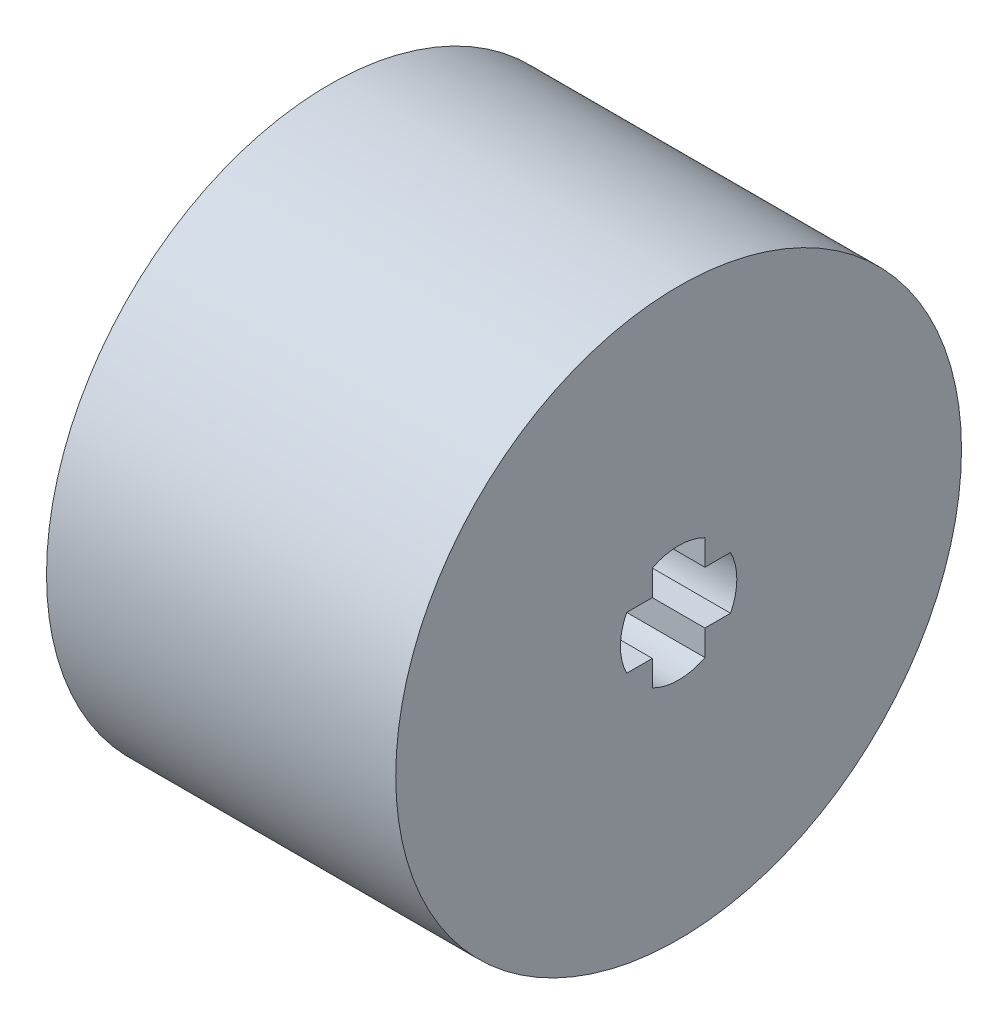
ISO-10303-21;
HEADER;
FILE_DESCRIPTION(('STEP AP214'),'2;1');
FILE_NAME('part.step','',(''),(''),'','','');
FILE_SCHEMA(('AUTOMOTIVE_DESIGN { 1 0 10303 214 1 1 1 1 }'));
ENDSEC;
DATA;
#1=APPLICATION_CONTEXT('core data for automotive mechanical design processes');
#2=APPLICATION_PROTOCOL_DEFINITION('international standard','automotive_design',2000,#1);
#3=PRODUCT_CONTEXT('',#1,'mechanical');
#4=PRODUCT('Part','Part','',(#3));
#5=PRODUCT_RELATED_PRODUCT_CATEGORY('part','',(#4));
#6=PRODUCT_DEFINITION_FORMATION('','',#4);
#7=PRODUCT_DEFINITION_CONTEXT('part definition',#1,'design');
#8=PRODUCT_DEFINITION('design','',#6,#7);
#9=PRODUCT_DEFINITION_SHAPE('','',#8);
#10=(LENGTH_UNIT() NAMED_UNIT(*) SI_UNIT(.MILLI.,.METRE.));
#11=(NAMED_UNIT(*) PLANE_ANGLE_UNIT() SI_UNIT($,.RADIAN.));
#12=(NAMED_UNIT(*) SI_UNIT($,.STERADIAN.) SOLID_ANGLE_UNIT());
#13=UNCERTAINTY_MEASURE_WITH_UNIT(LENGTH_MEASURE(1.E-05),#10,'distance_accuracy_value','');
#14=(GEOMETRIC_REPRESENTATION_CONTEXT(3) GLOBAL_UNCERTAINTY_ASSIGNED_CONTEXT((#13)) GLOBAL_UNIT_ASSIGNED_CONTEXT((#10,
#11,#12)) REPRESENTATION_CONTEXT('',''));
#15=CARTESIAN_POINT('',(0.,0.,0.));
#16=DIRECTION('',(0.,0.,1.));
#17=DIRECTION('',(1.,0.,0.));
#18=AXIS2_PLACEMENT_3D('',#15,#16,#17);
#19=CARTESIAN_POINT('',(0.,0.,1.13002976164114));
#20=DIRECTION('',(0.,0.,-1.));
#21=DIRECTION('',(-1.,0.,0.));
#22=AXIS2_PLACEMENT_3D('',#19,#20,#21);
#23=PLANE('',#22);
#24=DIRECTION('',(1.,0.,0.));
#25=VECTOR('',#24,1.);
#26=CARTESIAN_POINT('',(0.,1.13002976164115,1.13002976164114));
#27=LINE('',#26,#25);
#28=CARTESIAN_POINT('',(7.,1.13002976164115,1.13002976164114));
#29=VERTEX_POINT('',#28);
#30=CARTESIAN_POINT('',(15.,1.13002976164115,1.13002976164114));
#31=VERTEX_POINT('',#30);
#32=EDGE_CURVE('E59',#29,#31,#27,.T.);
#33=ORIENTED_EDGE('',*,*,#32,.F.);
#34=DIRECTION('',(0.,1.,0.));
#35=VECTOR('',#34,1.);
#36=CARTESIAN_POINT('',(7.,0.,1.13002976164114));
#37=LINE('',#36,#35);
#38=CARTESIAN_POINT('',(7.,2.23002976164114,1.13002976164114));
#39=VERTEX_POINT('',#38);
#40=EDGE_CURVE('E53',#29,#39,#37,.T.);
#41=ORIENTED_EDGE('',*,*,#40,.T.);
#42=DIRECTION('',(1.,0.,0.));
#43=VECTOR('',#42,1.);
#44=CARTESIAN_POINT('',(0.,2.23002976164114,1.13002976164114));
#45=LINE('',#44,#43);
#46=CARTESIAN_POINT('',(15.,2.23002976164114,1.13002976164114));
#47=VERTEX_POINT('',#46);
#48=EDGE_CURVE('E153',#39,#47,#45,.T.);
#49=ORIENTED_EDGE('',*,*,#48,.T.);
#50=DIRECTION('',(0.,1.,0.));
#51=VECTOR('',#50,1.);
#52=CARTESIAN_POINT('',(15.,0.,1.13002976164114));
#53=LINE('',#52,#51);
#54=EDGE_CURVE('E223',#31,#47,#53,.T.);
#55=ORIENTED_EDGE('',*,*,#54,.F.);
#56=EDGE_LOOP('',(#33,#41,#49,#55));
#57=FACE_BOUND('',#56,.T.);
#58=ADVANCED_FACE('F38',(#57),#23,.T.);
#59=CARTESIAN_POINT('',(0.,0.,0.));
#60=DIRECTION('',(1.,0.,0.));
#61=DIRECTION('',(0.,0.,-1.));
#62=AXIS2_PLACEMENT_3D('',#59,#60,#61);
#63=CYLINDRICAL_SURFACE('',#62,2.5);
#64=CARTESIAN_POINT('',(7.,0.,0.));
#65=DIRECTION('',(-1.,0.,0.));
#66=DIRECTION('',(0.,0.,1.));
#67=AXIS2_PLACEMENT_3D('',#64,#65,#66);
#68=CIRCLE('',#67,2.5);
#69=CARTESIAN_POINT('',(7.,2.23002976164114,-1.13002976164114));
#70=VERTEX_POINT('',#69);
#71=EDGE_CURVE('E234',#70,#39,#68,.F.);
#72=ORIENTED_EDGE('',*,*,#71,.F.);
#73=DIRECTION('',(1.,0.,0.));
#74=VECTOR('',#73,1.);
#75=CARTESIAN_POINT('',(0.,2.23002976164114,-1.13002976164114));
#76=LINE('',#75,#74);
#77=CARTESIAN_POINT('',(15.,2.23002976164114,-1.13002976164114));
#78=VERTEX_POINT('',#77);
#79=EDGE_CURVE('E156',#70,#78,#76,.T.);
#80=ORIENTED_EDGE('',*,*,#79,.T.);
#81=CARTESIAN_POINT('',(15.,0.,0.));
#82=DIRECTION('',(1.,0.,0.));
#83=DIRECTION('',(0.,0.,-1.));
#84=AXIS2_PLACEMENT_3D('',#81,#82,#83);
#85=CIRCLE('',#84,2.5);
#86=EDGE_CURVE('E146',#78,#47,#85,.T.);
#87=ORIENTED_EDGE('',*,*,#86,.T.);
#88=ORIENTED_EDGE('',*,*,#48,.F.);
#89=EDGE_LOOP('',(#72,#80,#87,#88));
#90=FACE_BOUND('',#89,.T.);
#91=ADVANCED_FACE('F222',(#90),#63,.F.);
#92=CARTESIAN_POINT('',(0.,0.,-1.13002976164114));
#93=DIRECTION('',(0.,0.,-1.));
#94=DIRECTION('',(-1.,0.,0.));
#95=AXIS2_PLACEMENT_3D('',#92,#93,#94);
#96=PLANE('',#95);
#97=DIRECTION('',(0.,1.,0.));
#98=VECTOR('',#97,1.);
#99=CARTESIAN_POINT('',(7.,0.,-1.13002976164114));
#100=LINE('',#99,#98);
#101=CARTESIAN_POINT('',(7.,1.13002976164115,-1.13002976164114));
#102=VERTEX_POINT('',#101);
#103=EDGE_CURVE('E236',#102,#70,#100,.T.);
#104=ORIENTED_EDGE('',*,*,#103,.F.);
#105=DIRECTION('',(1.,0.,0.));
#106=VECTOR('',#105,1.);
#107=CARTESIAN_POINT('',(0.,1.13002976164115,-1.13002976164114));
#108=LINE('',#107,#106);
#109=CARTESIAN_POINT('',(15.,1.13002976164115,-1.13002976164114));
#110=VERTEX_POINT('',#109);
#111=EDGE_CURVE('E161',#102,#110,#108,.T.);
#112=ORIENTED_EDGE('',*,*,#111,.T.);
#113=DIRECTION('',(0.,1.,0.));
#114=VECTOR('',#113,1.);
#115=CARTESIAN_POINT('',(15.,0.,-1.13002976164114));
#116=LINE('',#115,#114);
#117=EDGE_CURVE('E213',#110,#78,#116,.T.);
#118=ORIENTED_EDGE('',*,*,#117,.T.);
#119=ORIENTED_EDGE('',*,*,#79,.F.);
#120=EDGE_LOOP('',(#104,#112,#118,#119));
#121=FACE_BOUND('',#120,.T.);
#122=ADVANCED_FACE('F290',(#121),#96,.F.);
#123=CARTESIAN_POINT('',(0.,1.13002976164115,0.));
#124=DIRECTION('',(0.,-1.,0.));
#125=DIRECTION('',(0.,0.,-1.));
#126=AXIS2_PLACEMENT_3D('',#123,#124,#125);
#127=PLANE('',#126);
#128=ORIENTED_EDGE('',*,*,#111,.F.);
#129=DIRECTION('',(0.,0.,-1.));
#130=VECTOR('',#129,1.);
#131=CARTESIAN_POINT('',(7.,1.13002976164115,0.));
#132=LINE('',#131,#130);
#133=CARTESIAN_POINT('',(7.,1.13002976164115,-2.23002976164114));
#134=VERTEX_POINT('',#133);
#135=EDGE_CURVE('E238',#102,#134,#132,.T.);
#136=ORIENTED_EDGE('',*,*,#135,.T.);
#137=DIRECTION('',(1.,0.,0.));
#138=VECTOR('',#137,1.);
#139=CARTESIAN_POINT('',(0.,1.13002976164115,-2.23002976164114));
#140=LINE('',#139,#138);
#141=CARTESIAN_POINT('',(15.,1.13002976164115,-2.23002976164114));
#142=VERTEX_POINT('',#141);
#143=EDGE_CURVE('E167',#134,#142,#140,.T.);
#144=ORIENTED_EDGE('',*,*,#143,.T.);
#145=DIRECTION('',(0.,0.,-1.));
#146=VECTOR('',#145,1.);
#147=CARTESIAN_POINT('',(15.,1.13002976164115,0.));
#148=LINE('',#147,#146);
#149=EDGE_CURVE('E211',#110,#142,#148,.T.);
#150=ORIENTED_EDGE('',*,*,#149,.F.);
#151=EDGE_LOOP('',(#128,#136,#144,#150));
#152=FACE_BOUND('',#151,.T.);
#153=ADVANCED_FACE('F316',(#152),#127,.T.);
#154=CARTESIAN_POINT('',(0.,0.,0.));
#155=DIRECTION('',(1.,0.,0.));
#156=DIRECTION('',(0.,0.,-1.));
#157=AXIS2_PLACEMENT_3D('',#154,#155,#156);
#158=CYLINDRICAL_SURFACE('',#157,2.5);
#159=CARTESIAN_POINT('',(7.,0.,0.));
#160=DIRECTION('',(-1.,0.,0.));
#161=DIRECTION('',(0.,0.,1.));
#162=AXIS2_PLACEMENT_3D('',#159,#160,#161);
#163=CIRCLE('',#162,2.5);
#164=CARTESIAN_POINT('',(7.,-1.13002976164115,-2.23002976164114));
#165=VERTEX_POINT('',#164);
#166=EDGE_CURVE('E241',#165,#134,#163,.F.);
#167=ORIENTED_EDGE('',*,*,#166,.F.);
#168=DIRECTION('',(1.,0.,0.));
#169=VECTOR('',#168,1.);
#170=CARTESIAN_POINT('',(0.,-1.13002976164115,-2.23002976164114));
#171=LINE('',#170,#169);
#172=CARTESIAN_POINT('',(15.,-1.13002976164115,-2.23002976164114));
#173=VERTEX_POINT('',#172);
#174=EDGE_CURVE('E169',#165,#173,#171,.T.);
#175=ORIENTED_EDGE('',*,*,#174,.T.);
#176=CARTESIAN_POINT('',(15.,0.,0.));
#177=DIRECTION('',(1.,0.,0.));
#178=DIRECTION('',(0.,0.,-1.));
#179=AXIS2_PLACEMENT_3D('',#176,#177,#178);
#180=CIRCLE('',#179,2.5);
#181=EDGE_CURVE('E208',#173,#142,#180,.T.);
#182=ORIENTED_EDGE('',*,*,#181,.T.);
#183=ORIENTED_EDGE('',*,*,#143,.F.);
#184=EDGE_LOOP('',(#167,#175,#182,#183));
#185=FACE_BOUND('',#184,.T.);
#186=ADVANCED_FACE('F312',(#185),#158,.F.);
#187=CARTESIAN_POINT('',(0.,-1.13002976164115,0.));
#188=DIRECTION('',(0.,-1.,0.));
#189=DIRECTION('',(0.,0.,-1.));
#190=AXIS2_PLACEMENT_3D('',#187,#188,#189);
#191=PLANE('',#190);
#192=DIRECTION('',(0.,0.,-1.));
#193=VECTOR('',#192,1.);
#194=CARTESIAN_POINT('',(7.,-1.13002976164115,0.));
#195=LINE('',#194,#193);
#196=CARTESIAN_POINT('',(7.,-1.13002976164115,-1.13002976164114));
#197=VERTEX_POINT('',#196);
#198=EDGE_CURVE('E243',#197,#165,#195,.T.);
#199=ORIENTED_EDGE('',*,*,#198,.F.);
#200=DIRECTION('',(1.,0.,0.));
#201=VECTOR('',#200,1.);
#202=CARTESIAN_POINT('',(0.,-1.13002976164115,-1.13002976164114));
#203=LINE('',#202,#201);
#204=CARTESIAN_POINT('',(15.,-1.13002976164115,-1.13002976164114));
#205=VERTEX_POINT('',#204);
#206=EDGE_CURVE('E171',#197,#205,#203,.T.);
#207=ORIENTED_EDGE('',*,*,#206,.T.);
#208=DIRECTION('',(0.,0.,-1.));
#209=VECTOR('',#208,1.);
#210=CARTESIAN_POINT('',(15.,-1.13002976164115,0.));
#211=LINE('',#210,#209);
#212=EDGE_CURVE('E205',#205,#173,#211,.T.);
#213=ORIENTED_EDGE('',*,*,#212,.T.);
#214=ORIENTED_EDGE('',*,*,#174,.F.);
#215=EDGE_LOOP('',(#199,#207,#213,#214));
#216=FACE_BOUND('',#215,.T.);
#217=ADVANCED_FACE('F308',(#216),#191,.F.);
#218=CARTESIAN_POINT('',(0.,0.,-1.13002976164114));
#219=DIRECTION('',(0.,0.,-1.));
#220=DIRECTION('',(-1.,0.,0.));
#221=AXIS2_PLACEMENT_3D('',#218,#219,#220);
#222=PLANE('',#221);
#223=DIRECTION('',(0.,1.,0.));
#224=VECTOR('',#223,1.);
#225=CARTESIAN_POINT('',(7.,0.,-1.13002976164114));
#226=LINE('',#225,#224);
#227=CARTESIAN_POINT('',(7.,-2.23002976164114,-1.13002976164114));
#228=VERTEX_POINT('',#227);
#229=EDGE_CURVE('E245',#228,#197,#226,.T.);
#230=ORIENTED_EDGE('',*,*,#229,.F.);
#231=DIRECTION('',(1.,0.,0.));
#232=VECTOR('',#231,1.);
#233=CARTESIAN_POINT('',(0.,-2.23002976164114,-1.13002976164114));
#234=LINE('',#233,#232);
#235=CARTESIAN_POINT('',(15.,-2.23002976164114,-1.13002976164114));
#236=VERTEX_POINT('',#235);
#237=EDGE_CURVE('E173',#228,#236,#234,.T.);
#238=ORIENTED_EDGE('',*,*,#237,.T.);
#239=DIRECTION('',(0.,1.,0.));
#240=VECTOR('',#239,1.);
#241=CARTESIAN_POINT('',(15.,0.,-1.13002976164114));
#242=LINE('',#241,#240);
#243=EDGE_CURVE('E199',#236,#205,#242,.T.);
#244=ORIENTED_EDGE('',*,*,#243,.T.);
#245=ORIENTED_EDGE('',*,*,#206,.F.);
#246=EDGE_LOOP('',(#230,#238,#244,#245));
#247=FACE_BOUND('',#246,.T.);
#248=ADVANCED_FACE('F304',(#247),#222,.F.);
#249=CARTESIAN_POINT('',(0.,0.,0.));
#250=DIRECTION('',(1.,0.,0.));
#251=DIRECTION('',(0.,0.,-1.));
#252=AXIS2_PLACEMENT_3D('',#249,#250,#251);
#253=CYLINDRICAL_SURFACE('',#252,2.5);
#254=CARTESIAN_POINT('',(7.,0.,0.));
#255=DIRECTION('',(-1.,0.,0.));
#256=DIRECTION('',(0.,0.,1.));
#257=AXIS2_PLACEMENT_3D('',#254,#255,#256);
#258=CIRCLE('',#257,2.5);
#259=CARTESIAN_POINT('',(7.,-2.23002976164114,1.13002976164114));
#260=VERTEX_POINT('',#259);
#261=EDGE_CURVE('E247',#260,#228,#258,.F.);
#262=ORIENTED_EDGE('',*,*,#261,.F.);
#263=DIRECTION('',(1.,0.,0.));
#264=VECTOR('',#263,1.);
#265=CARTESIAN_POINT('',(0.,-2.23002976164114,1.13002976164114));
#266=LINE('',#265,#264);
#267=CARTESIAN_POINT('',(15.,-2.23002976164114,1.13002976164114));
#268=VERTEX_POINT('',#267);
#269=EDGE_CURVE('E175',#260,#268,#266,.T.);
#270=ORIENTED_EDGE('',*,*,#269,.T.);
#271=CARTESIAN_POINT('',(15.,0.,0.));
#272=DIRECTION('',(1.,0.,0.));
#273=DIRECTION('',(0.,0.,-1.));
#274=AXIS2_PLACEMENT_3D('',#271,#272,#273);
#275=CIRCLE('',#274,2.5);
#276=EDGE_CURVE('E197',#268,#236,#275,.T.);
#277=ORIENTED_EDGE('',*,*,#276,.T.);
#278=ORIENTED_EDGE('',*,*,#237,.F.);
#279=EDGE_LOOP('',(#262,#270,#277,#278));
#280=FACE_BOUND('',#279,.T.);
#281=ADVANCED_FACE('F301',(#280),#253,.F.);
#282=CARTESIAN_POINT('',(0.,0.,1.13002976164114));
#283=DIRECTION('',(0.,0.,-1.));
#284=DIRECTION('',(-1.,0.,0.));
#285=AXIS2_PLACEMENT_3D('',#282,#283,#284);
#286=PLANE('',#285);
#287=ORIENTED_EDGE('',*,*,#269,.F.);
#288=DIRECTION('',(0.,1.,0.));
#289=VECTOR('',#288,1.);
#290=CARTESIAN_POINT('',(7.,0.,1.13002976164114));
#291=LINE('',#290,#289);
#292=CARTESIAN_POINT('',(7.,-1.13002976164115,1.13002976164114));
#293=VERTEX_POINT('',#292);
#294=EDGE_CURVE('E186',#260,#293,#291,.T.);
#295=ORIENTED_EDGE('',*,*,#294,.T.);
#296=DIRECTION('',(1.,0.,0.));
#297=VECTOR('',#296,1.);
#298=CARTESIAN_POINT('',(0.,-1.13002976164115,1.13002976164114));
#299=LINE('',#298,#297);
#300=CARTESIAN_POINT('',(15.,-1.13002976164115,1.13002976164114));
#301=VERTEX_POINT('',#300);
#302=EDGE_CURVE('E144',#293,#301,#299,.T.);
#303=ORIENTED_EDGE('',*,*,#302,.T.);
#304=DIRECTION('',(0.,1.,0.));
#305=VECTOR('',#304,1.);
#306=CARTESIAN_POINT('',(15.,0.,1.13002976164114));
#307=LINE('',#306,#305);
#308=EDGE_CURVE('E184',#268,#301,#307,.T.);
#309=ORIENTED_EDGE('',*,*,#308,.F.);
#310=EDGE_LOOP('',(#287,#295,#303,#309));
#311=FACE_BOUND('',#310,.T.);
#312=ADVANCED_FACE('F182',(#311),#286,.T.);
#313=CARTESIAN_POINT('',(0.,-1.13002976164115,0.));
#314=DIRECTION('',(0.,-1.,0.));
#315=DIRECTION('',(0.,0.,-1.));
#316=AXIS2_PLACEMENT_3D('',#313,#314,#315);
#317=PLANE('',#316);
#318=DIRECTION('',(0.,0.,-1.));
#319=VECTOR('',#318,1.);
#320=CARTESIAN_POINT('',(7.,-1.13002976164115,0.));
#321=LINE('',#320,#319);
#322=CARTESIAN_POINT('',(7.,-1.13002976164115,2.23002976164114));
#323=VERTEX_POINT('',#322);
#324=EDGE_CURVE('E136',#323,#293,#321,.T.);
#325=ORIENTED_EDGE('',*,*,#324,.F.);
#326=DIRECTION('',(1.,0.,0.));
#327=VECTOR('',#326,1.);
#328=CARTESIAN_POINT('',(0.,-1.13002976164115,2.23002976164114));
#329=LINE('',#328,#327);
#330=CARTESIAN_POINT('',(15.,-1.13002976164115,2.23002976164114));
#331=VERTEX_POINT('',#330);
#332=EDGE_CURVE('E135',#323,#331,#329,.T.);
#333=ORIENTED_EDGE('',*,*,#332,.T.);
#334=DIRECTION('',(0.,0.,-1.));
#335=VECTOR('',#334,1.);
#336=CARTESIAN_POINT('',(15.,-1.13002976164115,0.));
#337=LINE('',#336,#335);
#338=EDGE_CURVE('E189',#331,#301,#337,.T.);
#339=ORIENTED_EDGE('',*,*,#338,.T.);
#340=ORIENTED_EDGE('',*,*,#302,.F.);
#341=EDGE_LOOP('',(#325,#333,#339,#340));
#342=FACE_BOUND('',#341,.T.);
#343=ADVANCED_FACE('F190',(#342),#317,.F.);
#344=CARTESIAN_POINT('',(0.,0.,0.));
#345=DIRECTION('',(1.,0.,0.));
#346=DIRECTION('',(0.,0.,-1.));
#347=AXIS2_PLACEMENT_3D('',#344,#345,#346);
#348=CYLINDRICAL_SURFACE('',#347,2.5);
#349=CARTESIAN_POINT('',(7.,0.,0.));
#350=DIRECTION('',(-1.,0.,0.));
#351=DIRECTION('',(0.,0.,1.));
#352=AXIS2_PLACEMENT_3D('',#349,#350,#351);
#353=CIRCLE('',#352,2.5);
#354=CARTESIAN_POINT('',(7.,1.13002976164115,2.23002976164114));
#355=VERTEX_POINT('',#354);
#356=EDGE_CURVE('E127',#355,#323,#353,.F.);
#357=ORIENTED_EDGE('',*,*,#356,.F.);
#358=DIRECTION('',(1.,0.,0.));
#359=VECTOR('',#358,1.);
#360=CARTESIAN_POINT('',(0.,1.13002976164115,2.23002976164114));
#361=LINE('',#360,#359);
#362=CARTESIAN_POINT('',(15.,1.13002976164115,2.23002976164114));
#363=VERTEX_POINT('',#362);
#364=EDGE_CURVE('E134',#355,#363,#361,.T.);
#365=ORIENTED_EDGE('',*,*,#364,.T.);
#366=CARTESIAN_POINT('',(15.,0.,0.));
#367=DIRECTION('',(1.,0.,0.));
#368=DIRECTION('',(0.,0.,-1.));
#369=AXIS2_PLACEMENT_3D('',#366,#367,#368);
#370=CIRCLE('',#369,2.5);
#371=EDGE_CURVE('E192',#363,#331,#370,.T.);
#372=ORIENTED_EDGE('',*,*,#371,.T.);
#373=ORIENTED_EDGE('',*,*,#332,.F.);
#374=EDGE_LOOP('',(#357,#365,#372,#373));
#375=FACE_BOUND('',#374,.T.);
#376=ADVANCED_FACE('F132',(#375),#348,.F.);
#377=CARTESIAN_POINT('',(0.,1.13002976164115,0.));
#378=DIRECTION('',(0.,-1.,0.));
#379=DIRECTION('',(0.,0.,-1.));
#380=AXIS2_PLACEMENT_3D('',#377,#378,#379);
#381=PLANE('',#380);
#382=ORIENTED_EDGE('',*,*,#364,.F.);
#383=DIRECTION('',(0.,0.,-1.));
#384=VECTOR('',#383,1.);
#385=CARTESIAN_POINT('',(7.,1.13002976164115,0.));
#386=LINE('',#385,#384);
#387=EDGE_CURVE('E11',#355,#29,#386,.T.);
#388=ORIENTED_EDGE('',*,*,#387,.T.);
#389=ORIENTED_EDGE('',*,*,#32,.T.);
#390=DIRECTION('',(0.,0.,-1.));
#391=VECTOR('',#390,1.);
#392=CARTESIAN_POINT('',(15.,1.13002976164115,0.));
#393=LINE('',#392,#391);
#394=EDGE_CURVE('E141',#363,#31,#393,.T.);
#395=ORIENTED_EDGE('',*,*,#394,.F.);
#396=EDGE_LOOP('',(#382,#388,#389,#395));
#397=FACE_BOUND('',#396,.T.);
#398=ADVANCED_FACE('F139',(#397),#381,.T.);
#399=CARTESIAN_POINT('',(15.,0.,0.));
#400=DIRECTION('',(1.,0.,0.));
#401=DIRECTION('',(0.,0.,-1.));
#402=AXIS2_PLACEMENT_3D('',#399,#400,#401);
#403=PLANE('',#402);
#404=CARTESIAN_POINT('',(15.,0.,0.));
#405=DIRECTION('',(1.,0.,0.));
#406=DIRECTION('',(0.,0.,-1.));
#407=AXIS2_PLACEMENT_3D('',#404,#405,#406);
#408=CIRCLE('',#407,12.15);
#409=CARTESIAN_POINT('',(15.,0.,-12.15));
#410=VERTEX_POINT('',#409);
#411=EDGE_CURVE('E46',#410,#410,#408,.T.);
#412=ORIENTED_EDGE('',*,*,#411,.T.);
#413=EDGE_LOOP('',(#412));
#414=FACE_BOUND('',#413,.T.);
#415=ORIENTED_EDGE('',*,*,#394,.T.);
#416=ORIENTED_EDGE('',*,*,#54,.T.);
#417=ORIENTED_EDGE('',*,*,#86,.F.);
#418=ORIENTED_EDGE('',*,*,#117,.F.);
#419=ORIENTED_EDGE('',*,*,#149,.T.);
#420=ORIENTED_EDGE('',*,*,#181,.F.);
#421=ORIENTED_EDGE('',*,*,#212,.F.);
#422=ORIENTED_EDGE('',*,*,#243,.F.);
#423=ORIENTED_EDGE('',*,*,#276,.F.);
#424=ORIENTED_EDGE('',*,*,#308,.T.);
#425=ORIENTED_EDGE('',*,*,#338,.F.);
#426=ORIENTED_EDGE('',*,*,#371,.F.);
#427=EDGE_LOOP('',(#415,#416,#417,#418,#419,#420,#421,#422,#423,#424,#425,#426));
#428=FACE_BOUND('',#427,.T.);
#429=ADVANCED_FACE('F194',(#414,#428),#403,.T.);
#430=CARTESIAN_POINT('',(0.,0.,0.));
#431=DIRECTION('',(1.,0.,0.));
#432=DIRECTION('',(0.,0.,-1.));
#433=AXIS2_PLACEMENT_3D('',#430,#431,#432);
#434=PLANE('',#433);
#435=CARTESIAN_POINT('',(0.,0.,0.));
#436=DIRECTION('',(-1.,0.,0.));
#437=DIRECTION('',(0.,0.,1.));
#438=AXIS2_PLACEMENT_3D('',#435,#436,#437);
#439=CIRCLE('',#438,7.5);
#440=CARTESIAN_POINT('',(0.,0.,7.5));
#441=VERTEX_POINT('',#440);
#442=EDGE_CURVE('E228',#441,#441,#439,.T.);
#443=ORIENTED_EDGE('',*,*,#442,.F.);
#444=EDGE_LOOP('',(#443));
#445=FACE_BOUND('',#444,.T.);
#446=CARTESIAN_POINT('',(0.,0.,0.));
#447=DIRECTION('',(1.,0.,0.));
#448=DIRECTION('',(0.,0.,-1.));
#449=AXIS2_PLACEMENT_3D('',#446,#447,#448);
#450=CIRCLE('',#449,12.15);
#451=CARTESIAN_POINT('',(0.,0.,-12.15));
#452=VERTEX_POINT('',#451);
#453=EDGE_CURVE('E151',#452,#452,#450,.T.);
#454=ORIENTED_EDGE('',*,*,#453,.F.);
#455=EDGE_LOOP('',(#454));
#456=FACE_BOUND('',#455,.T.);
#457=ADVANCED_FACE('F275',(#445,#456),#434,.F.);
#458=CARTESIAN_POINT('',(15.,0.,0.));
#459=DIRECTION('',(-1.,0.,0.));
#460=DIRECTION('',(0.,0.,1.));
#461=AXIS2_PLACEMENT_3D('',#458,#459,#460);
#462=CYLINDRICAL_SURFACE('',#461,12.15);
#463=ORIENTED_EDGE('',*,*,#411,.F.);
#464=EDGE_LOOP('',(#463));
#465=FACE_BOUND('',#464,.T.);
#466=ORIENTED_EDGE('',*,*,#453,.T.);
#467=EDGE_LOOP('',(#466));
#468=FACE_BOUND('',#467,.T.);
#469=ADVANCED_FACE('F40',(#465,#468),#462,.T.);
#470=CARTESIAN_POINT('',(4.,0.,0.));
#471=DIRECTION('',(-1.,0.,0.));
#472=DIRECTION('',(0.,0.,1.));
#473=AXIS2_PLACEMENT_3D('',#470,#471,#472);
#474=CYLINDRICAL_SURFACE('',#473,7.5);
#475=CARTESIAN_POINT('',(4.,0.,0.));
#476=DIRECTION('',(-1.,0.,0.));
#477=DIRECTION('',(0.,0.,1.));
#478=AXIS2_PLACEMENT_3D('',#475,#476,#477);
#479=CIRCLE('',#478,7.5);
#480=CARTESIAN_POINT('',(4.,0.,7.5));
#481=VERTEX_POINT('',#480);
#482=EDGE_CURVE('E224',#481,#481,#479,.T.);
#483=ORIENTED_EDGE('',*,*,#482,.F.);
#484=EDGE_LOOP('',(#483));
#485=FACE_BOUND('',#484,.T.);
#486=ORIENTED_EDGE('',*,*,#442,.T.);
#487=EDGE_LOOP('',(#486));
#488=FACE_BOUND('',#487,.T.);
#489=ADVANCED_FACE('F266',(#485,#488),#474,.F.);
#490=CARTESIAN_POINT('',(4.,0.,0.));
#491=DIRECTION('',(-1.,0.,0.));
#492=DIRECTION('',(0.,0.,1.));
#493=AXIS2_PLACEMENT_3D('',#490,#491,#492);
#494=PLANE('',#493);
#495=CARTESIAN_POINT('',(4.,0.,0.));
#496=DIRECTION('',(-1.,0.,0.));
#497=DIRECTION('',(0.,0.,1.));
#498=AXIS2_PLACEMENT_3D('',#495,#496,#497);
#499=CIRCLE('',#498,4.);
#500=CARTESIAN_POINT('',(4.,0.,4.));
#501=VERTEX_POINT('',#500);
#502=EDGE_CURVE('E251',#501,#501,#499,.T.);
#503=ORIENTED_EDGE('',*,*,#502,.F.);
#504=EDGE_LOOP('',(#503));
#505=FACE_BOUND('',#504,.T.);
#506=ORIENTED_EDGE('',*,*,#482,.T.);
#507=EDGE_LOOP('',(#506));
#508=FACE_BOUND('',#507,.T.);
#509=ADVANCED_FACE('F260',(#505,#508),#494,.T.);
#510=CARTESIAN_POINT('',(7.,0.,0.));
#511=DIRECTION('',(-1.,0.,0.));
#512=DIRECTION('',(0.,0.,1.));
#513=AXIS2_PLACEMENT_3D('',#510,#511,#512);
#514=CYLINDRICAL_SURFACE('',#513,4.);
#515=CARTESIAN_POINT('',(7.,0.,0.));
#516=DIRECTION('',(-1.,0.,0.));
#517=DIRECTION('',(0.,0.,1.));
#518=AXIS2_PLACEMENT_3D('',#515,#516,#517);
#519=CIRCLE('',#518,4.);
#520=CARTESIAN_POINT('',(7.,0.,4.));
#521=VERTEX_POINT('',#520);
#522=EDGE_CURVE('E137',#521,#521,#519,.T.);
#523=ORIENTED_EDGE('',*,*,#522,.F.);
#524=EDGE_LOOP('',(#523));
#525=FACE_BOUND('',#524,.T.);
#526=ORIENTED_EDGE('',*,*,#502,.T.);
#527=EDGE_LOOP('',(#526));
#528=FACE_BOUND('',#527,.T.);
#529=ADVANCED_FACE('F257',(#525,#528),#514,.F.);
#530=CARTESIAN_POINT('',(7.,0.,0.));
#531=DIRECTION('',(-1.,0.,0.));
#532=DIRECTION('',(0.,0.,1.));
#533=AXIS2_PLACEMENT_3D('',#530,#531,#532);
#534=PLANE('',#533);
#535=ORIENTED_EDGE('',*,*,#387,.F.);
#536=ORIENTED_EDGE('',*,*,#356,.T.);
#537=ORIENTED_EDGE('',*,*,#324,.T.);
#538=ORIENTED_EDGE('',*,*,#294,.F.);
#539=ORIENTED_EDGE('',*,*,#261,.T.);
#540=ORIENTED_EDGE('',*,*,#229,.T.);
#541=ORIENTED_EDGE('',*,*,#198,.T.);
#542=ORIENTED_EDGE('',*,*,#166,.T.);
#543=ORIENTED_EDGE('',*,*,#135,.F.);
#544=ORIENTED_EDGE('',*,*,#103,.T.);
#545=ORIENTED_EDGE('',*,*,#71,.T.);
#546=ORIENTED_EDGE('',*,*,#40,.F.);
#547=EDGE_LOOP('',(#535,#536,#537,#538,#539,#540,#541,#542,#543,#544,#545,#546));
#548=FACE_BOUND('',#547,.T.);
#549=ORIENTED_EDGE('',*,*,#522,.T.);
#550=EDGE_LOOP('',(#549));
#551=FACE_BOUND('',#550,.T.);
#552=ADVANCED_FACE('F125',(#548,#551),#534,.T.);
#553=CLOSED_SHELL('',(#58,#91,#122,#153,#186,#217,#248,#281,#312,#343,#376,#398,#429,#457,#469,
#489,#509,#529,#552));
#554=MANIFOLD_SOLID_BREP('B2',#553);
#555=ADVANCED_BREP_SHAPE_REPRESENTATION('',(#18,#554),#14);
#556=SHAPE_DEFINITION_REPRESENTATION(#9,#555);
ENDSEC;
END-ISO-10303-21;
